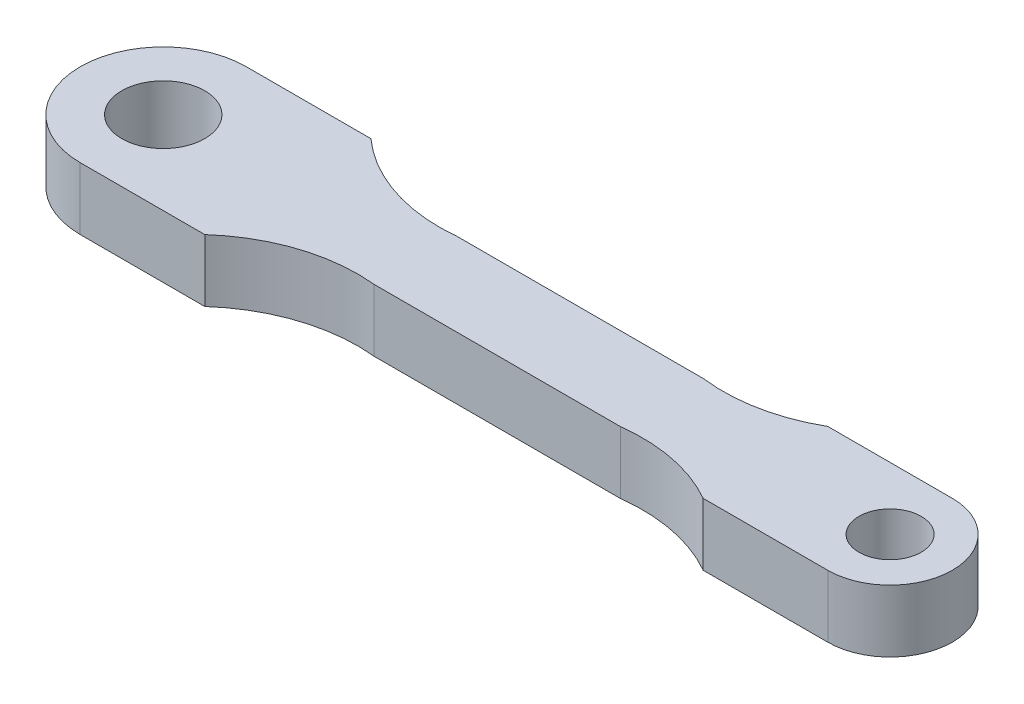
ISO-10303-21;
HEADER;
FILE_DESCRIPTION(('STEP AP214'),'2;1');
FILE_NAME('part.step','',(''),(''),'','','');
FILE_SCHEMA(('AUTOMOTIVE_DESIGN { 1 0 10303 214 1 1 1 1 }'));
ENDSEC;
DATA;
#1=APPLICATION_CONTEXT('core data for automotive mechanical design processes');
#2=APPLICATION_PROTOCOL_DEFINITION('international standard','automotive_design',2000,#1);
#3=PRODUCT_CONTEXT('',#1,'mechanical');
#4=PRODUCT('Part','Part','',(#3));
#5=PRODUCT_RELATED_PRODUCT_CATEGORY('part','',(#4));
#6=PRODUCT_DEFINITION_FORMATION('','',#4);
#7=PRODUCT_DEFINITION_CONTEXT('part definition',#1,'design');
#8=PRODUCT_DEFINITION('design','',#6,#7);
#9=PRODUCT_DEFINITION_SHAPE('','',#8);
#10=(LENGTH_UNIT() NAMED_UNIT(*) SI_UNIT(.MILLI.,.METRE.));
#11=(NAMED_UNIT(*) PLANE_ANGLE_UNIT() SI_UNIT($,.RADIAN.));
#12=(NAMED_UNIT(*) SI_UNIT($,.STERADIAN.) SOLID_ANGLE_UNIT());
#13=UNCERTAINTY_MEASURE_WITH_UNIT(LENGTH_MEASURE(1.E-05),#10,'distance_accuracy_value','');
#14=(GEOMETRIC_REPRESENTATION_CONTEXT(3) GLOBAL_UNCERTAINTY_ASSIGNED_CONTEXT((#13)) GLOBAL_UNIT_ASSIGNED_CONTEXT((#10,
#11,#12)) REPRESENTATION_CONTEXT('',''));
#15=CARTESIAN_POINT('',(0.,0.,0.));
#16=DIRECTION('',(0.,0.,1.));
#17=DIRECTION('',(1.,0.,0.));
#18=AXIS2_PLACEMENT_3D('',#15,#16,#17);
#19=CARTESIAN_POINT('',(0.,1.5,4.));
#20=DIRECTION('',(0.,0.,-1.));
#21=DIRECTION('',(-1.,0.,0.));
#22=AXIS2_PLACEMENT_3D('',#19,#20,#21);
#23=PLANE('',#22);
#24=DIRECTION('',(1.,0.,0.));
#25=VECTOR('',#24,1.);
#26=CARTESIAN_POINT('',(0.,-1.5,4.));
#27=LINE('',#26,#25);
#28=CARTESIAN_POINT('',(-17.5,-1.5,4.));
#29=VERTEX_POINT('',#28);
#30=CARTESIAN_POINT('',(-11.5,-1.5,4.));
#31=VERTEX_POINT('',#30);
#32=EDGE_CURVE('E174',#29,#31,#27,.T.);
#33=ORIENTED_EDGE('',*,*,#32,.T.);
#34=DIRECTION('',(0.,-1.,0.));
#35=VECTOR('',#34,1.);
#36=CARTESIAN_POINT('',(-11.5,1.5,4.));
#37=LINE('',#36,#35);
#38=CARTESIAN_POINT('',(-11.5,1.5,4.));
#39=VERTEX_POINT('',#38);
#40=EDGE_CURVE('E11',#39,#31,#37,.T.);
#41=ORIENTED_EDGE('',*,*,#40,.F.);
#42=DIRECTION('',(1.,0.,0.));
#43=VECTOR('',#42,1.);
#44=CARTESIAN_POINT('',(0.,1.5,4.));
#45=LINE('',#44,#43);
#46=CARTESIAN_POINT('',(-17.5,1.5,4.));
#47=VERTEX_POINT('',#46);
#48=EDGE_CURVE('E222',#47,#39,#45,.T.);
#49=ORIENTED_EDGE('',*,*,#48,.F.);
#50=DIRECTION('',(0.,-1.,0.));
#51=VECTOR('',#50,1.);
#52=CARTESIAN_POINT('',(-17.5,1.5,4.));
#53=LINE('',#52,#51);
#54=EDGE_CURVE('E173',#47,#29,#53,.T.);
#55=ORIENTED_EDGE('',*,*,#54,.T.);
#56=EDGE_LOOP('',(#33,#41,#49,#55));
#57=FACE_BOUND('',#56,.T.);
#58=ADVANCED_FACE('F41',(#57),#23,.F.);
#59=CARTESIAN_POINT('',(-6.16112555065737,1.5,9.9578871770248));
#60=DIRECTION('',(0.,-1.,0.));
#61=DIRECTION('',(0.,0.,-1.));
#62=AXIS2_PLACEMENT_3D('',#59,#60,#61);
#63=CYLINDRICAL_SURFACE('',#62,8.);
#64=CARTESIAN_POINT('',(-6.16112555065737,-1.5,9.9578871770248));
#65=DIRECTION('',(0.,1.,0.));
#66=DIRECTION('',(0.,0.,1.));
#67=AXIS2_PLACEMENT_3D('',#64,#65,#66);
#68=CIRCLE('',#67,8.);
#69=CARTESIAN_POINT('',(-5.34135016816271,-1.5,2.));
#70=VERTEX_POINT('',#69);
#71=EDGE_CURVE('E178',#31,#70,#68,.F.);
#72=ORIENTED_EDGE('',*,*,#71,.T.);
#73=DIRECTION('',(0.,-1.,0.));
#74=VECTOR('',#73,1.);
#75=CARTESIAN_POINT('',(-5.34135016816271,1.5,2.));
#76=LINE('',#75,#74);
#77=CARTESIAN_POINT('',(-5.34135016816271,1.5,2.));
#78=VERTEX_POINT('',#77);
#79=EDGE_CURVE('E50',#78,#70,#76,.T.);
#80=ORIENTED_EDGE('',*,*,#79,.F.);
#81=CARTESIAN_POINT('',(-6.16112555065737,1.5,9.9578871770248));
#82=DIRECTION('',(0.,1.,0.));
#83=DIRECTION('',(0.,0.,1.));
#84=AXIS2_PLACEMENT_3D('',#81,#82,#83);
#85=CIRCLE('',#84,8.);
#86=EDGE_CURVE('E109',#39,#78,#85,.F.);
#87=ORIENTED_EDGE('',*,*,#86,.F.);
#88=ORIENTED_EDGE('',*,*,#40,.T.);
#89=EDGE_LOOP('',(#72,#80,#87,#88));
#90=FACE_BOUND('',#89,.T.);
#91=ADVANCED_FACE('F311',(#90),#63,.F.);
#92=CARTESIAN_POINT('',(0.,1.5,2.));
#93=DIRECTION('',(0.,0.,-1.));
#94=DIRECTION('',(-1.,0.,0.));
#95=AXIS2_PLACEMENT_3D('',#92,#93,#94);
#96=PLANE('',#95);
#97=DIRECTION('',(1.,0.,0.));
#98=VECTOR('',#97,1.);
#99=CARTESIAN_POINT('',(0.,-1.5,2.));
#100=LINE('',#99,#98);
#101=CARTESIAN_POINT('',(6.51697990794925,-1.5,2.));
#102=VERTEX_POINT('',#101);
#103=EDGE_CURVE('E181',#70,#102,#100,.T.);
#104=ORIENTED_EDGE('',*,*,#103,.T.);
#105=DIRECTION('',(0.,-1.,0.));
#106=VECTOR('',#105,1.);
#107=CARTESIAN_POINT('',(6.51697990794925,1.5,2.));
#108=LINE('',#107,#106);
#109=CARTESIAN_POINT('',(6.51697990794925,1.5,2.));
#110=VERTEX_POINT('',#109);
#111=EDGE_CURVE('E245',#110,#102,#108,.T.);
#112=ORIENTED_EDGE('',*,*,#111,.F.);
#113=DIRECTION('',(1.,0.,0.));
#114=VECTOR('',#113,1.);
#115=CARTESIAN_POINT('',(0.,1.5,2.));
#116=LINE('',#115,#114);
#117=EDGE_CURVE('E255',#78,#110,#116,.T.);
#118=ORIENTED_EDGE('',*,*,#117,.F.);
#119=ORIENTED_EDGE('',*,*,#79,.T.);
#120=EDGE_LOOP('',(#104,#112,#118,#119));
#121=FACE_BOUND('',#120,.T.);
#122=ADVANCED_FACE('F253',(#121),#96,.F.);
#123=CARTESIAN_POINT('',(7.51594443241441,1.5,9.93738432223488));
#124=DIRECTION('',(0.,-1.,0.));
#125=DIRECTION('',(0.,0.,-1.));
#126=AXIS2_PLACEMENT_3D('',#123,#124,#125);
#127=CYLINDRICAL_SURFACE('',#126,8.);
#128=CARTESIAN_POINT('',(7.51594443241441,-1.5,9.93738432223488));
#129=DIRECTION('',(0.,1.,0.));
#130=DIRECTION('',(0.,0.,1.));
#131=AXIS2_PLACEMENT_3D('',#128,#129,#130);
#132=CIRCLE('',#131,8.);
#133=CARTESIAN_POINT('',(11.5,-1.5,3.00000000000001));
#134=VERTEX_POINT('',#133);
#135=EDGE_CURVE('E184',#102,#134,#132,.F.);
#136=ORIENTED_EDGE('',*,*,#135,.T.);
#137=DIRECTION('',(0.,-1.,0.));
#138=VECTOR('',#137,1.);
#139=CARTESIAN_POINT('',(11.5,1.5,3.00000000000001));
#140=LINE('',#139,#138);
#141=CARTESIAN_POINT('',(11.5,1.5,3.00000000000001));
#142=VERTEX_POINT('',#141);
#143=EDGE_CURVE('E242',#142,#134,#140,.T.);
#144=ORIENTED_EDGE('',*,*,#143,.F.);
#145=CARTESIAN_POINT('',(7.51594443241441,1.5,9.93738432223488));
#146=DIRECTION('',(0.,1.,0.));
#147=DIRECTION('',(0.,0.,1.));
#148=AXIS2_PLACEMENT_3D('',#145,#146,#147);
#149=CIRCLE('',#148,8.);
#150=EDGE_CURVE('E268',#110,#142,#149,.F.);
#151=ORIENTED_EDGE('',*,*,#150,.F.);
#152=ORIENTED_EDGE('',*,*,#111,.T.);
#153=EDGE_LOOP('',(#136,#144,#151,#152));
#154=FACE_BOUND('',#153,.T.);
#155=ADVANCED_FACE('F265',(#154),#127,.F.);
#156=CARTESIAN_POINT('',(0.,1.5,3.00000000000003));
#157=DIRECTION('',(0.,0.,1.));
#158=DIRECTION('',(1.,0.,0.));
#159=AXIS2_PLACEMENT_3D('',#156,#157,#158);
#160=PLANE('',#159);
#161=DIRECTION('',(-1.,0.,0.));
#162=VECTOR('',#161,1.);
#163=CARTESIAN_POINT('',(0.,-1.5,3.00000000000003));
#164=LINE('',#163,#162);
#165=CARTESIAN_POINT('',(17.5,-1.5,2.99999999999999));
#166=VERTEX_POINT('',#165);
#167=EDGE_CURVE('E188',#166,#134,#164,.T.);
#168=ORIENTED_EDGE('',*,*,#167,.F.);
#169=DIRECTION('',(0.,-1.,0.));
#170=VECTOR('',#169,1.);
#171=CARTESIAN_POINT('',(17.5,1.5,2.99999999999999));
#172=LINE('',#171,#170);
#173=CARTESIAN_POINT('',(17.5,1.5,2.99999999999999));
#174=VERTEX_POINT('',#173);
#175=EDGE_CURVE('E239',#174,#166,#172,.T.);
#176=ORIENTED_EDGE('',*,*,#175,.F.);
#177=DIRECTION('',(-1.,0.,0.));
#178=VECTOR('',#177,1.);
#179=CARTESIAN_POINT('',(0.,1.5,3.00000000000003));
#180=LINE('',#179,#178);
#181=EDGE_CURVE('E271',#174,#142,#180,.T.);
#182=ORIENTED_EDGE('',*,*,#181,.T.);
#183=ORIENTED_EDGE('',*,*,#143,.T.);
#184=EDGE_LOOP('',(#168,#176,#182,#183));
#185=FACE_BOUND('',#184,.T.);
#186=ADVANCED_FACE('F322',(#185),#160,.T.);
#187=CARTESIAN_POINT('',(17.5,1.5,0.));
#188=DIRECTION('',(0.,-1.,0.));
#189=DIRECTION('',(0.,0.,-1.));
#190=AXIS2_PLACEMENT_3D('',#187,#188,#189);
#191=CYLINDRICAL_SURFACE('',#190,3.);
#192=CARTESIAN_POINT('',(17.5,-1.5,0.));
#193=DIRECTION('',(0.,1.,0.));
#194=DIRECTION('',(0.,0.,1.));
#195=AXIS2_PLACEMENT_3D('',#192,#193,#194);
#196=CIRCLE('',#195,3.);
#197=CARTESIAN_POINT('',(17.5,-1.5,-3.00000000000001));
#198=VERTEX_POINT('',#197);
#199=EDGE_CURVE('E192',#166,#198,#196,.T.);
#200=ORIENTED_EDGE('',*,*,#199,.T.);
#201=DIRECTION('',(0.,-1.,0.));
#202=VECTOR('',#201,1.);
#203=CARTESIAN_POINT('',(17.5,1.5,-3.00000000000001));
#204=LINE('',#203,#202);
#205=CARTESIAN_POINT('',(17.5,1.5,-3.00000000000001));
#206=VERTEX_POINT('',#205);
#207=EDGE_CURVE('E235',#206,#198,#204,.T.);
#208=ORIENTED_EDGE('',*,*,#207,.F.);
#209=CARTESIAN_POINT('',(17.5,1.5,0.));
#210=DIRECTION('',(0.,1.,0.));
#211=DIRECTION('',(0.,0.,1.));
#212=AXIS2_PLACEMENT_3D('',#209,#210,#211);
#213=CIRCLE('',#212,3.);
#214=EDGE_CURVE('E275',#174,#206,#213,.T.);
#215=ORIENTED_EDGE('',*,*,#214,.F.);
#216=ORIENTED_EDGE('',*,*,#175,.T.);
#217=EDGE_LOOP('',(#200,#208,#215,#216));
#218=FACE_BOUND('',#217,.T.);
#219=ADVANCED_FACE('F325',(#218),#191,.T.);
#220=CARTESIAN_POINT('',(0.,1.5,-3.));
#221=DIRECTION('',(0.,0.,1.));
#222=DIRECTION('',(1.,0.,0.));
#223=AXIS2_PLACEMENT_3D('',#220,#221,#222);
#224=PLANE('',#223);
#225=DIRECTION('',(-1.,0.,0.));
#226=VECTOR('',#225,1.);
#227=CARTESIAN_POINT('',(0.,-1.5,-3.));
#228=LINE('',#227,#226);
#229=CARTESIAN_POINT('',(11.5,-1.5,-3.00000000000001));
#230=VERTEX_POINT('',#229);
#231=EDGE_CURVE('E195',#198,#230,#228,.T.);
#232=ORIENTED_EDGE('',*,*,#231,.T.);
#233=DIRECTION('',(0.,-1.,0.));
#234=VECTOR('',#233,1.);
#235=CARTESIAN_POINT('',(11.5,1.5,-3.00000000000001));
#236=LINE('',#235,#234);
#237=CARTESIAN_POINT('',(11.5,1.5,-3.00000000000001));
#238=VERTEX_POINT('',#237);
#239=EDGE_CURVE('E232',#238,#230,#236,.T.);
#240=ORIENTED_EDGE('',*,*,#239,.F.);
#241=DIRECTION('',(-1.,0.,0.));
#242=VECTOR('',#241,1.);
#243=CARTESIAN_POINT('',(0.,1.5,-3.));
#244=LINE('',#243,#242);
#245=EDGE_CURVE('E282',#206,#238,#244,.T.);
#246=ORIENTED_EDGE('',*,*,#245,.F.);
#247=ORIENTED_EDGE('',*,*,#207,.T.);
#248=EDGE_LOOP('',(#232,#240,#246,#247));
#249=FACE_BOUND('',#248,.T.);
#250=ADVANCED_FACE('F329',(#249),#224,.F.);
#251=CARTESIAN_POINT('',(7.51594443241441,1.5,-9.93738432223488));
#252=DIRECTION('',(0.,-1.,0.));
#253=DIRECTION('',(0.,0.,-1.));
#254=AXIS2_PLACEMENT_3D('',#251,#252,#253);
#255=CYLINDRICAL_SURFACE('',#254,8.);
#256=CARTESIAN_POINT('',(7.51594443241441,-1.5,-9.93738432223488));
#257=DIRECTION('',(0.,1.,0.));
#258=DIRECTION('',(0.,0.,1.));
#259=AXIS2_PLACEMENT_3D('',#256,#257,#258);
#260=CIRCLE('',#259,8.);
#261=CARTESIAN_POINT('',(6.51697990794925,-1.5,-2.));
#262=VERTEX_POINT('',#261);
#263=EDGE_CURVE('E199',#262,#230,#260,.T.);
#264=ORIENTED_EDGE('',*,*,#263,.F.);
#265=DIRECTION('',(0.,-1.,0.));
#266=VECTOR('',#265,1.);
#267=CARTESIAN_POINT('',(6.51697990794925,1.5,-2.));
#268=LINE('',#267,#266);
#269=CARTESIAN_POINT('',(6.51697990794925,1.5,-2.));
#270=VERTEX_POINT('',#269);
#271=EDGE_CURVE('E229',#270,#262,#268,.T.);
#272=ORIENTED_EDGE('',*,*,#271,.F.);
#273=CARTESIAN_POINT('',(7.51594443241441,1.5,-9.93738432223488));
#274=DIRECTION('',(0.,1.,0.));
#275=DIRECTION('',(0.,0.,1.));
#276=AXIS2_PLACEMENT_3D('',#273,#274,#275);
#277=CIRCLE('',#276,8.);
#278=EDGE_CURVE('E285',#270,#238,#277,.T.);
#279=ORIENTED_EDGE('',*,*,#278,.T.);
#280=ORIENTED_EDGE('',*,*,#239,.T.);
#281=EDGE_LOOP('',(#264,#272,#279,#280));
#282=FACE_BOUND('',#281,.T.);
#283=ADVANCED_FACE('F333',(#282),#255,.F.);
#284=CARTESIAN_POINT('',(0.,1.5,-2.));
#285=DIRECTION('',(0.,0.,-1.));
#286=DIRECTION('',(-1.,0.,0.));
#287=AXIS2_PLACEMENT_3D('',#284,#285,#286);
#288=PLANE('',#287);
#289=DIRECTION('',(1.,0.,0.));
#290=VECTOR('',#289,1.);
#291=CARTESIAN_POINT('',(0.,-1.5,-2.));
#292=LINE('',#291,#290);
#293=CARTESIAN_POINT('',(-5.34135016816271,-1.5,-2.));
#294=VERTEX_POINT('',#293);
#295=EDGE_CURVE('E203',#294,#262,#292,.T.);
#296=ORIENTED_EDGE('',*,*,#295,.F.);
#297=DIRECTION('',(0.,-1.,0.));
#298=VECTOR('',#297,1.);
#299=CARTESIAN_POINT('',(-5.34135016816271,1.5,-2.));
#300=LINE('',#299,#298);
#301=CARTESIAN_POINT('',(-5.34135016816271,1.5,-2.));
#302=VERTEX_POINT('',#301);
#303=EDGE_CURVE('E147',#302,#294,#300,.T.);
#304=ORIENTED_EDGE('',*,*,#303,.F.);
#305=DIRECTION('',(1.,0.,0.));
#306=VECTOR('',#305,1.);
#307=CARTESIAN_POINT('',(0.,1.5,-2.));
#308=LINE('',#307,#306);
#309=EDGE_CURVE('E155',#302,#270,#308,.T.);
#310=ORIENTED_EDGE('',*,*,#309,.T.);
#311=ORIENTED_EDGE('',*,*,#271,.T.);
#312=EDGE_LOOP('',(#296,#304,#310,#311));
#313=FACE_BOUND('',#312,.T.);
#314=ADVANCED_FACE('F291',(#313),#288,.T.);
#315=CARTESIAN_POINT('',(-6.16112555065738,1.5,-9.9578871770248));
#316=DIRECTION('',(0.,-1.,0.));
#317=DIRECTION('',(0.,0.,-1.));
#318=AXIS2_PLACEMENT_3D('',#315,#316,#317);
#319=CYLINDRICAL_SURFACE('',#318,8.);
#320=CARTESIAN_POINT('',(-6.16112555065738,-1.5,-9.9578871770248));
#321=DIRECTION('',(0.,1.,0.));
#322=DIRECTION('',(0.,0.,1.));
#323=AXIS2_PLACEMENT_3D('',#320,#321,#322);
#324=CIRCLE('',#323,8.);
#325=CARTESIAN_POINT('',(-11.5,-1.5,-4.));
#326=VERTEX_POINT('',#325);
#327=EDGE_CURVE('E141',#326,#294,#324,.T.);
#328=ORIENTED_EDGE('',*,*,#327,.F.);
#329=DIRECTION('',(0.,-1.,0.));
#330=VECTOR('',#329,1.);
#331=CARTESIAN_POINT('',(-11.5,1.5,-4.));
#332=LINE('',#331,#330);
#333=CARTESIAN_POINT('',(-11.5,1.5,-4.));
#334=VERTEX_POINT('',#333);
#335=EDGE_CURVE('E136',#334,#326,#332,.T.);
#336=ORIENTED_EDGE('',*,*,#335,.F.);
#337=CARTESIAN_POINT('',(-6.16112555065738,1.5,-9.9578871770248));
#338=DIRECTION('',(0.,1.,0.));
#339=DIRECTION('',(0.,0.,1.));
#340=AXIS2_PLACEMENT_3D('',#337,#338,#339);
#341=CIRCLE('',#340,8.);
#342=EDGE_CURVE('E139',#334,#302,#341,.T.);
#343=ORIENTED_EDGE('',*,*,#342,.T.);
#344=ORIENTED_EDGE('',*,*,#303,.T.);
#345=EDGE_LOOP('',(#328,#336,#343,#344));
#346=FACE_BOUND('',#345,.T.);
#347=ADVANCED_FACE('F138',(#346),#319,.F.);
#348=CARTESIAN_POINT('',(0.,1.5,-4.));
#349=DIRECTION('',(0.,0.,-1.));
#350=DIRECTION('',(-1.,0.,0.));
#351=AXIS2_PLACEMENT_3D('',#348,#349,#350);
#352=PLANE('',#351);
#353=DIRECTION('',(1.,0.,0.));
#354=VECTOR('',#353,1.);
#355=CARTESIAN_POINT('',(0.,-1.5,-4.));
#356=LINE('',#355,#354);
#357=CARTESIAN_POINT('',(-17.5,-1.5,-4.));
#358=VERTEX_POINT('',#357);
#359=EDGE_CURVE('E209',#358,#326,#356,.T.);
#360=ORIENTED_EDGE('',*,*,#359,.F.);
#361=DIRECTION('',(0.,-1.,0.));
#362=VECTOR('',#361,1.);
#363=CARTESIAN_POINT('',(-17.5,1.5,-4.));
#364=LINE('',#363,#362);
#365=CARTESIAN_POINT('',(-17.5,1.5,-4.));
#366=VERTEX_POINT('',#365);
#367=EDGE_CURVE('E98',#366,#358,#364,.T.);
#368=ORIENTED_EDGE('',*,*,#367,.F.);
#369=DIRECTION('',(1.,0.,0.));
#370=VECTOR('',#369,1.);
#371=CARTESIAN_POINT('',(0.,1.5,-4.));
#372=LINE('',#371,#370);
#373=EDGE_CURVE('E152',#366,#334,#372,.T.);
#374=ORIENTED_EDGE('',*,*,#373,.T.);
#375=ORIENTED_EDGE('',*,*,#335,.T.);
#376=EDGE_LOOP('',(#360,#368,#374,#375));
#377=FACE_BOUND('',#376,.T.);
#378=ADVANCED_FACE('F158',(#377),#352,.T.);
#379=CARTESIAN_POINT('',(-17.5,1.5,0.));
#380=DIRECTION('',(0.,-1.,0.));
#381=DIRECTION('',(0.,0.,-1.));
#382=AXIS2_PLACEMENT_3D('',#379,#380,#381);
#383=CYLINDRICAL_SURFACE('',#382,2.);
#384=CARTESIAN_POINT('',(-17.5,1.5,0.));
#385=DIRECTION('',(0.,1.,0.));
#386=DIRECTION('',(0.,0.,1.));
#387=AXIS2_PLACEMENT_3D('',#384,#385,#386);
#388=CIRCLE('',#387,2.);
#389=CARTESIAN_POINT('',(-17.5,1.5,2.));
#390=VERTEX_POINT('',#389);
#391=EDGE_CURVE('E162',#390,#390,#388,.T.);
#392=ORIENTED_EDGE('',*,*,#391,.T.);
#393=EDGE_LOOP('',(#392));
#394=FACE_BOUND('',#393,.T.);
#395=CARTESIAN_POINT('',(-17.5,-1.5,0.));
#396=DIRECTION('',(0.,1.,0.));
#397=DIRECTION('',(0.,0.,1.));
#398=AXIS2_PLACEMENT_3D('',#395,#396,#397);
#399=CIRCLE('',#398,2.);
#400=CARTESIAN_POINT('',(-17.5,-1.5,2.));
#401=VERTEX_POINT('',#400);
#402=EDGE_CURVE('E214',#401,#401,#399,.T.);
#403=ORIENTED_EDGE('',*,*,#402,.F.);
#404=EDGE_LOOP('',(#403));
#405=FACE_BOUND('',#404,.T.);
#406=ADVANCED_FACE('F299',(#394,#405),#383,.F.);
#407=CARTESIAN_POINT('',(-17.5,1.5,0.));
#408=DIRECTION('',(0.,-1.,0.));
#409=DIRECTION('',(0.,0.,-1.));
#410=AXIS2_PLACEMENT_3D('',#407,#408,#409);
#411=CYLINDRICAL_SURFACE('',#410,4.);
#412=CARTESIAN_POINT('',(-17.5,-1.5,0.));
#413=DIRECTION('',(0.,1.,0.));
#414=DIRECTION('',(0.,0.,1.));
#415=AXIS2_PLACEMENT_3D('',#412,#413,#414);
#416=CIRCLE('',#415,4.);
#417=EDGE_CURVE('E101',#358,#29,#416,.T.);
#418=ORIENTED_EDGE('',*,*,#417,.T.);
#419=ORIENTED_EDGE('',*,*,#54,.F.);
#420=CARTESIAN_POINT('',(-17.5,1.5,0.));
#421=DIRECTION('',(0.,1.,0.));
#422=DIRECTION('',(0.,0.,1.));
#423=AXIS2_PLACEMENT_3D('',#420,#421,#422);
#424=CIRCLE('',#423,4.);
#425=EDGE_CURVE('E58',#366,#47,#424,.T.);
#426=ORIENTED_EDGE('',*,*,#425,.F.);
#427=ORIENTED_EDGE('',*,*,#367,.T.);
#428=EDGE_LOOP('',(#418,#419,#426,#427));
#429=FACE_BOUND('',#428,.T.);
#430=ADVANCED_FACE('F296',(#429),#411,.T.);
#431=CARTESIAN_POINT('',(17.5,1.5,0.));
#432=DIRECTION('',(0.,-1.,0.));
#433=DIRECTION('',(0.,0.,-1.));
#434=AXIS2_PLACEMENT_3D('',#431,#432,#433);
#435=CYLINDRICAL_SURFACE('',#434,1.5);
#436=CARTESIAN_POINT('',(17.5,1.5,0.));
#437=DIRECTION('',(0.,1.,0.));
#438=DIRECTION('',(0.,0.,1.));
#439=AXIS2_PLACEMENT_3D('',#436,#437,#438);
#440=CIRCLE('',#439,1.5);
#441=CARTESIAN_POINT('',(17.5,1.5,1.49999999999999));
#442=VERTEX_POINT('',#441);
#443=EDGE_CURVE('E169',#442,#442,#440,.T.);
#444=ORIENTED_EDGE('',*,*,#443,.T.);
#445=EDGE_LOOP('',(#444));
#446=FACE_BOUND('',#445,.T.);
#447=CARTESIAN_POINT('',(17.5,-1.5,0.));
#448=DIRECTION('',(0.,1.,0.));
#449=DIRECTION('',(0.,0.,1.));
#450=AXIS2_PLACEMENT_3D('',#447,#448,#449);
#451=CIRCLE('',#450,1.5);
#452=CARTESIAN_POINT('',(17.5,-1.5,1.49999999999999));
#453=VERTEX_POINT('',#452);
#454=EDGE_CURVE('E218',#453,#453,#451,.T.);
#455=ORIENTED_EDGE('',*,*,#454,.F.);
#456=EDGE_LOOP('',(#455));
#457=FACE_BOUND('',#456,.T.);
#458=ADVANCED_FACE('F298',(#446,#457),#435,.F.);
#459=CARTESIAN_POINT('',(0.,1.5,0.));
#460=DIRECTION('',(0.,1.,0.));
#461=DIRECTION('',(0.,0.,1.));
#462=AXIS2_PLACEMENT_3D('',#459,#460,#461);
#463=PLANE('',#462);
#464=ORIENTED_EDGE('',*,*,#48,.T.);
#465=ORIENTED_EDGE('',*,*,#86,.T.);
#466=ORIENTED_EDGE('',*,*,#117,.T.);
#467=ORIENTED_EDGE('',*,*,#150,.T.);
#468=ORIENTED_EDGE('',*,*,#181,.F.);
#469=ORIENTED_EDGE('',*,*,#214,.T.);
#470=ORIENTED_EDGE('',*,*,#245,.T.);
#471=ORIENTED_EDGE('',*,*,#278,.F.);
#472=ORIENTED_EDGE('',*,*,#309,.F.);
#473=ORIENTED_EDGE('',*,*,#342,.F.);
#474=ORIENTED_EDGE('',*,*,#373,.F.);
#475=ORIENTED_EDGE('',*,*,#425,.T.);
#476=EDGE_LOOP('',(#464,#465,#466,#467,#468,#469,#470,#471,#472,#473,#474,#475));
#477=FACE_BOUND('',#476,.T.);
#478=ORIENTED_EDGE('',*,*,#391,.F.);
#479=EDGE_LOOP('',(#478));
#480=FACE_BOUND('',#479,.T.);
#481=ORIENTED_EDGE('',*,*,#443,.F.);
#482=EDGE_LOOP('',(#481));
#483=FACE_BOUND('',#482,.T.);
#484=ADVANCED_FACE('F150',(#477,#480,#483),#463,.T.);
#485=CARTESIAN_POINT('',(0.,-1.5,0.));
#486=DIRECTION('',(0.,1.,0.));
#487=DIRECTION('',(0.,0.,1.));
#488=AXIS2_PLACEMENT_3D('',#485,#486,#487);
#489=PLANE('',#488);
#490=ORIENTED_EDGE('',*,*,#32,.F.);
#491=ORIENTED_EDGE('',*,*,#417,.F.);
#492=ORIENTED_EDGE('',*,*,#359,.T.);
#493=ORIENTED_EDGE('',*,*,#327,.T.);
#494=ORIENTED_EDGE('',*,*,#295,.T.);
#495=ORIENTED_EDGE('',*,*,#263,.T.);
#496=ORIENTED_EDGE('',*,*,#231,.F.);
#497=ORIENTED_EDGE('',*,*,#199,.F.);
#498=ORIENTED_EDGE('',*,*,#167,.T.);
#499=ORIENTED_EDGE('',*,*,#135,.F.);
#500=ORIENTED_EDGE('',*,*,#103,.F.);
#501=ORIENTED_EDGE('',*,*,#71,.F.);
#502=EDGE_LOOP('',(#490,#491,#492,#493,#494,#495,#496,#497,#498,#499,#500,#501));
#503=FACE_BOUND('',#502,.T.);
#504=ORIENTED_EDGE('',*,*,#402,.T.);
#505=EDGE_LOOP('',(#504));
#506=FACE_BOUND('',#505,.T.);
#507=ORIENTED_EDGE('',*,*,#454,.T.);
#508=EDGE_LOOP('',(#507));
#509=FACE_BOUND('',#508,.T.);
#510=ADVANCED_FACE('F259',(#503,#506,#509),#489,.F.);
#511=CLOSED_SHELL('',(#58,#91,#122,#155,#186,#219,#250,#283,#314,#347,#378,#406,#430,#458,#484,#510));
#512=MANIFOLD_SOLID_BREP('B2',#511);
#513=ADVANCED_BREP_SHAPE_REPRESENTATION('',(#18,#512),#14);
#514=SHAPE_DEFINITION_REPRESENTATION(#9,#513);
ENDSEC;
END-ISO-10303-21;
